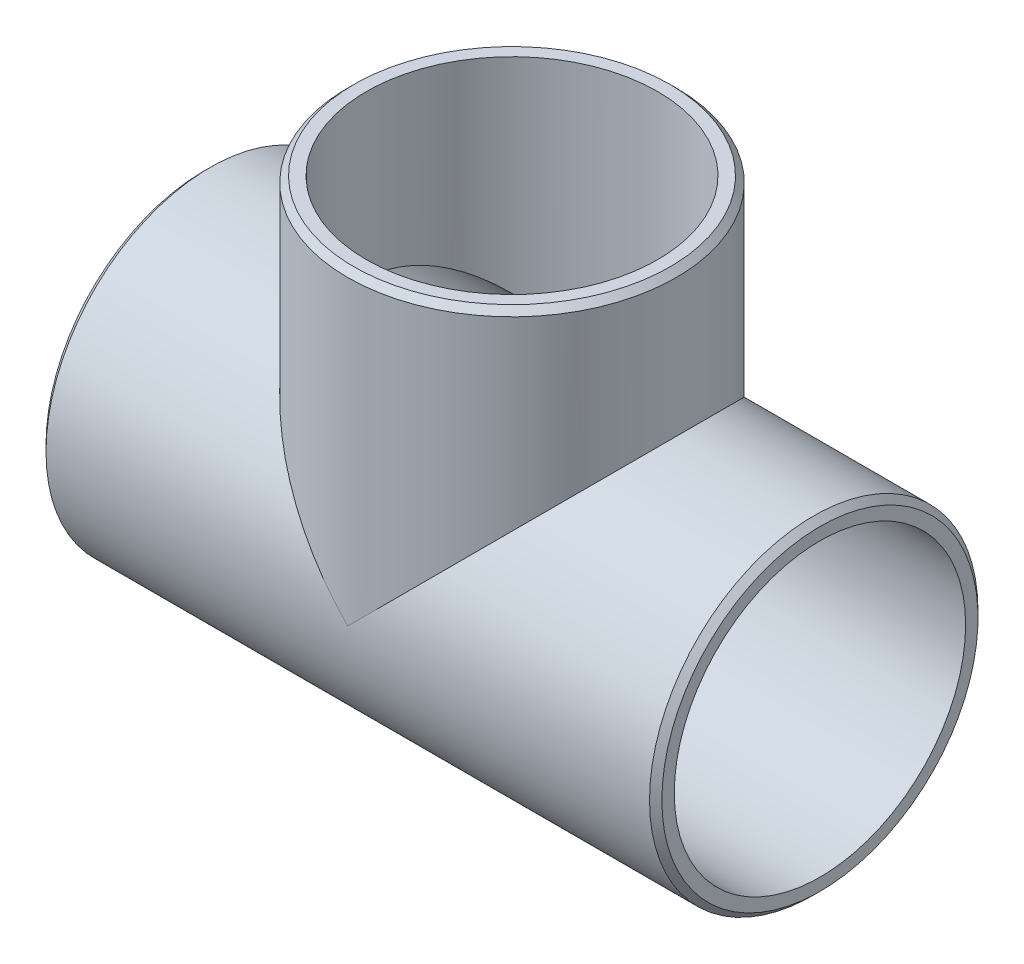
ISO-10303-21;
HEADER;
FILE_DESCRIPTION(('STEP AP214'),'2;1');
FILE_NAME('part.step','',(''),(''),'','','');
FILE_SCHEMA(('AUTOMOTIVE_DESIGN { 1 0 10303 214 1 1 1 1 }'));
ENDSEC;
DATA;
#1=APPLICATION_CONTEXT('core data for automotive mechanical design processes');
#2=APPLICATION_PROTOCOL_DEFINITION('international standard','automotive_design',2000,#1);
#3=PRODUCT_CONTEXT('',#1,'mechanical');
#4=PRODUCT('Part','Part','',(#3));
#5=PRODUCT_RELATED_PRODUCT_CATEGORY('part','',(#4));
#6=PRODUCT_DEFINITION_FORMATION('','',#4);
#7=PRODUCT_DEFINITION_CONTEXT('part definition',#1,'design');
#8=PRODUCT_DEFINITION('design','',#6,#7);
#9=PRODUCT_DEFINITION_SHAPE('','',#8);
#10=(LENGTH_UNIT() NAMED_UNIT(*) SI_UNIT(.MILLI.,.METRE.));
#11=(NAMED_UNIT(*) PLANE_ANGLE_UNIT() SI_UNIT($,.RADIAN.));
#12=(NAMED_UNIT(*) SI_UNIT($,.STERADIAN.) SOLID_ANGLE_UNIT());
#13=UNCERTAINTY_MEASURE_WITH_UNIT(LENGTH_MEASURE(1.E-05),#10,'distance_accuracy_value','');
#14=(GEOMETRIC_REPRESENTATION_CONTEXT(3) GLOBAL_UNCERTAINTY_ASSIGNED_CONTEXT((#13)) GLOBAL_UNIT_ASSIGNED_CONTEXT((#10,
#11,#12)) REPRESENTATION_CONTEXT('',''));
#15=CARTESIAN_POINT('',(0.,0.,0.));
#16=DIRECTION('',(0.,0.,1.));
#17=DIRECTION('',(1.,0.,0.));
#18=AXIS2_PLACEMENT_3D('',#15,#16,#17);
#19=CARTESIAN_POINT('',(-95.25,0.,0.));
#20=DIRECTION('',(-1.,0.,0.));
#21=DIRECTION('',(0.,0.,-1.));
#22=AXIS2_PLACEMENT_3D('',#19,#20,#21);
#23=PLANE('',#22);
#24=CARTESIAN_POINT('',(-95.25,0.,0.));
#25=DIRECTION('',(-1.,0.,0.));
#26=DIRECTION('',(0.,0.,1.));
#27=AXIS2_PLACEMENT_3D('',#24,#25,#26);
#28=CIRCLE('',#27,48.8865333333333);
#29=CARTESIAN_POINT('',(-95.25,0.,48.8865333333333));
#30=VERTEX_POINT('',#29);
#31=EDGE_CURVE('E46',#30,#30,#28,.T.);
#32=ORIENTED_EDGE('',*,*,#31,.T.);
#33=EDGE_LOOP('',(#32));
#34=FACE_BOUND('',#33,.T.);
#35=CARTESIAN_POINT('',(-95.25,0.,0.));
#36=DIRECTION('',(-1.,0.,0.));
#37=DIRECTION('',(0.,0.,1.));
#38=AXIS2_PLACEMENT_3D('',#35,#36,#37);
#39=CIRCLE('',#38,45.0596);
#40=CARTESIAN_POINT('',(-95.25,0.,45.0596));
#41=VERTEX_POINT('',#40);
#42=EDGE_CURVE('E73',#41,#41,#39,.F.);
#43=ORIENTED_EDGE('',*,*,#42,.T.);
#44=EDGE_LOOP('',(#43));
#45=FACE_BOUND('',#44,.T.);
#46=ADVANCED_FACE('F38',(#34,#45),#23,.T.);
#47=CARTESIAN_POINT('',(95.25,0.,0.));
#48=DIRECTION('',(-1.,0.,0.));
#49=DIRECTION('',(0.,0.,1.));
#50=AXIS2_PLACEMENT_3D('',#47,#48,#49);
#51=CYLINDRICAL_SURFACE('',#50,50.8);
#52=CARTESIAN_POINT('',(-93.3365333333333,0.,0.));
#53=DIRECTION('',(-1.,0.,0.));
#54=DIRECTION('',(0.,0.,1.));
#55=AXIS2_PLACEMENT_3D('',#52,#53,#54);
#56=CIRCLE('',#55,50.8);
#57=CARTESIAN_POINT('',(-93.3365333333333,0.,50.8));
#58=VERTEX_POINT('',#57);
#59=EDGE_CURVE('E92',#58,#58,#56,.F.);
#60=ORIENTED_EDGE('',*,*,#59,.T.);
#61=EDGE_LOOP('',(#60));
#62=FACE_BOUND('',#61,.T.);
#63=CARTESIAN_POINT('',(93.3365333333333,0.,0.));
#64=DIRECTION('',(1.,0.,0.));
#65=DIRECTION('',(0.,0.,-1.));
#66=AXIS2_PLACEMENT_3D('',#63,#64,#65);
#67=CIRCLE('',#66,50.8);
#68=CARTESIAN_POINT('',(93.3365333333333,0.,50.8));
#69=VERTEX_POINT('',#68);
#70=EDGE_CURVE('E89',#69,#69,#67,.F.);
#71=ORIENTED_EDGE('',*,*,#70,.T.);
#72=EDGE_LOOP('',(#71));
#73=FACE_BOUND('',#72,.T.);
#74=CARTESIAN_POINT('',(0.,0.,0.));
#75=DIRECTION('',(-0.707106781186547,-0.707106781186547,0.));
#76=DIRECTION('',(-0.707106781186547,0.707106781186547,0.));
#77=AXIS2_PLACEMENT_3D('',#74,#75,#76);
#78=ELLIPSE('',#77,71.8420489685532,50.8);
#79=CARTESIAN_POINT('',(0.,0.,-50.8));
#80=VERTEX_POINT('',#79);
#81=CARTESIAN_POINT('',(0.,0.,50.8));
#82=VERTEX_POINT('',#81);
#83=EDGE_CURVE('E55',#80,#82,#78,.F.);
#84=ORIENTED_EDGE('',*,*,#83,.F.);
#85=CARTESIAN_POINT('',(0.,0.,0.));
#86=DIRECTION('',(-0.707106781186547,0.707106781186547,0.));
#87=DIRECTION('',(-0.707106781186547,-0.707106781186547,0.));
#88=AXIS2_PLACEMENT_3D('',#85,#86,#87);
#89=ELLIPSE('',#88,71.8420489685532,50.8);
#90=EDGE_CURVE('E52',#82,#80,#89,.T.);
#91=ORIENTED_EDGE('',*,*,#90,.F.);
#92=EDGE_LOOP('',(#84,#91));
#93=FACE_BOUND('',#92,.T.);
#94=ADVANCED_FACE('F105',(#62,#73,#93),#51,.T.);
#95=CARTESIAN_POINT('',(95.25,0.,0.));
#96=DIRECTION('',(1.,0.,0.));
#97=DIRECTION('',(0.,0.,-1.));
#98=AXIS2_PLACEMENT_3D('',#95,#96,#97);
#99=PLANE('',#98);
#100=CARTESIAN_POINT('',(95.25,0.,0.));
#101=DIRECTION('',(1.,0.,0.));
#102=DIRECTION('',(0.,0.,-1.));
#103=AXIS2_PLACEMENT_3D('',#100,#101,#102);
#104=CIRCLE('',#103,48.8865333333333);
#105=CARTESIAN_POINT('',(95.25,0.,48.8865333333333));
#106=VERTEX_POINT('',#105);
#107=EDGE_CURVE('E11',#106,#106,#104,.T.);
#108=ORIENTED_EDGE('',*,*,#107,.T.);
#109=EDGE_LOOP('',(#108));
#110=FACE_BOUND('',#109,.T.);
#111=CARTESIAN_POINT('',(95.25,0.,0.));
#112=DIRECTION('',(1.,0.,0.));
#113=DIRECTION('',(0.,0.,-1.));
#114=AXIS2_PLACEMENT_3D('',#111,#112,#113);
#115=CIRCLE('',#114,45.0596);
#116=CARTESIAN_POINT('',(95.25,0.,-45.0596));
#117=VERTEX_POINT('',#116);
#118=EDGE_CURVE('E70',#117,#117,#115,.T.);
#119=ORIENTED_EDGE('',*,*,#118,.F.);
#120=EDGE_LOOP('',(#119));
#121=FACE_BOUND('',#120,.T.);
#122=ADVANCED_FACE('F108',(#110,#121),#99,.T.);
#123=CARTESIAN_POINT('',(0.,95.25,0.));
#124=DIRECTION('',(0.,-1.,0.));
#125=DIRECTION('',(0.,0.,-1.));
#126=AXIS2_PLACEMENT_3D('',#123,#124,#125);
#127=CYLINDRICAL_SURFACE('',#126,50.8);
#128=CARTESIAN_POINT('',(0.,93.3365333333333,0.));
#129=DIRECTION('',(0.,1.,0.));
#130=DIRECTION('',(0.,0.,1.));
#131=AXIS2_PLACEMENT_3D('',#128,#129,#130);
#132=CIRCLE('',#131,50.8);
#133=CARTESIAN_POINT('',(0.,93.3365333333333,-50.8));
#134=VERTEX_POINT('',#133);
#135=EDGE_CURVE('E86',#134,#134,#132,.F.);
#136=ORIENTED_EDGE('',*,*,#135,.T.);
#137=EDGE_LOOP('',(#136));
#138=FACE_BOUND('',#137,.T.);
#139=ORIENTED_EDGE('',*,*,#90,.T.);
#140=ORIENTED_EDGE('',*,*,#83,.T.);
#141=EDGE_LOOP('',(#139,#140));
#142=FACE_BOUND('',#141,.T.);
#143=ADVANCED_FACE('F118',(#138,#142),#127,.T.);
#144=CARTESIAN_POINT('',(0.,95.25,0.));
#145=DIRECTION('',(0.,1.,0.));
#146=DIRECTION('',(0.,0.,1.));
#147=AXIS2_PLACEMENT_3D('',#144,#145,#146);
#148=PLANE('',#147);
#149=CARTESIAN_POINT('',(0.,95.25,0.));
#150=DIRECTION('',(0.,1.,0.));
#151=DIRECTION('',(0.,0.,1.));
#152=AXIS2_PLACEMENT_3D('',#149,#150,#151);
#153=CIRCLE('',#152,48.8865333333333);
#154=CARTESIAN_POINT('',(0.,95.25,-48.8865333333333));
#155=VERTEX_POINT('',#154);
#156=EDGE_CURVE('E83',#155,#155,#153,.T.);
#157=ORIENTED_EDGE('',*,*,#156,.T.);
#158=EDGE_LOOP('',(#157));
#159=FACE_BOUND('',#158,.T.);
#160=CARTESIAN_POINT('',(0.,95.25,0.));
#161=DIRECTION('',(0.,1.,0.));
#162=DIRECTION('',(0.,0.,1.));
#163=AXIS2_PLACEMENT_3D('',#160,#161,#162);
#164=CIRCLE('',#163,45.0596);
#165=CARTESIAN_POINT('',(0.,95.25,45.0596));
#166=VERTEX_POINT('',#165);
#167=EDGE_CURVE('E77',#166,#166,#164,.T.);
#168=ORIENTED_EDGE('',*,*,#167,.F.);
#169=EDGE_LOOP('',(#168));
#170=FACE_BOUND('',#169,.T.);
#171=ADVANCED_FACE('F123',(#159,#170),#148,.T.);
#172=CARTESIAN_POINT('',(95.25,0.,0.));
#173=DIRECTION('',(-1.,0.,0.));
#174=DIRECTION('',(0.,0.,1.));
#175=AXIS2_PLACEMENT_3D('',#172,#173,#174);
#176=CYLINDRICAL_SURFACE('',#175,45.0596);
#177=ORIENTED_EDGE('',*,*,#42,.F.);
#178=EDGE_LOOP('',(#177));
#179=FACE_BOUND('',#178,.T.);
#180=ORIENTED_EDGE('',*,*,#118,.T.);
#181=EDGE_LOOP('',(#180));
#182=FACE_BOUND('',#181,.T.);
#183=CARTESIAN_POINT('',(0.,0.,0.));
#184=DIRECTION('',(-0.707106781186547,-0.707106781186547,0.));
#185=DIRECTION('',(-0.707106781186547,0.707106781186547,0.));
#186=AXIS2_PLACEMENT_3D('',#183,#184,#185);
#187=ELLIPSE('',#186,63.7238974351067,45.0596);
#188=CARTESIAN_POINT('',(0.,0.,-45.0596));
#189=VERTEX_POINT('',#188);
#190=CARTESIAN_POINT('',(0.,0.,45.0596));
#191=VERTEX_POINT('',#190);
#192=EDGE_CURVE('E63',#189,#191,#187,.F.);
#193=ORIENTED_EDGE('',*,*,#192,.T.);
#194=CARTESIAN_POINT('',(0.,0.,0.));
#195=DIRECTION('',(-0.707106781186547,0.707106781186547,0.));
#196=DIRECTION('',(-0.707106781186547,-0.707106781186547,0.));
#197=AXIS2_PLACEMENT_3D('',#194,#195,#196);
#198=ELLIPSE('',#197,63.7238974351067,45.0596);
#199=EDGE_CURVE('E66',#191,#189,#198,.T.);
#200=ORIENTED_EDGE('',*,*,#199,.T.);
#201=EDGE_LOOP('',(#193,#200));
#202=FACE_BOUND('',#201,.T.);
#203=ADVANCED_FACE('F69',(#179,#182,#202),#176,.F.);
#204=CARTESIAN_POINT('',(0.,95.25,0.));
#205=DIRECTION('',(0.,-1.,0.));
#206=DIRECTION('',(0.,0.,-1.));
#207=AXIS2_PLACEMENT_3D('',#204,#205,#206);
#208=CYLINDRICAL_SURFACE('',#207,45.0596);
#209=ORIENTED_EDGE('',*,*,#167,.T.);
#210=EDGE_LOOP('',(#209));
#211=FACE_BOUND('',#210,.T.);
#212=ORIENTED_EDGE('',*,*,#199,.F.);
#213=ORIENTED_EDGE('',*,*,#192,.F.);
#214=EDGE_LOOP('',(#212,#213));
#215=FACE_BOUND('',#214,.T.);
#216=ADVANCED_FACE('F65',(#211,#215),#208,.F.);
#217=CARTESIAN_POINT('',(0.,95.25,0.));
#218=DIRECTION('',(0.,-1.,0.));
#219=DIRECTION('',(0.,0.,-1.));
#220=AXIS2_PLACEMENT_3D('',#217,#218,#219);
#221=CONICAL_SURFACE('',#220,48.8865333333333,0.785398163397454);
#222=CARTESIAN_POINT('',(0.,93.3365333333333,-50.8));
#223=CARTESIAN_POINT('',(0.,93.3564652777778,-50.7800680555556));
#224=CARTESIAN_POINT('',(0.,93.3763972222222,-50.7601361111111));
#225=CARTESIAN_POINT('',(0.,93.4162611111111,-50.7202722222222));
#226=CARTESIAN_POINT('',(0.,93.4361930555555,-50.7003402777778));
#227=CARTESIAN_POINT('',(0.,93.4760569444444,-50.6604763888889));
#228=CARTESIAN_POINT('',(0.,93.4959888888889,-50.6405444444445));
#229=CARTESIAN_POINT('',(0.,93.5358527777777,-50.6006805555556));
#230=CARTESIAN_POINT('',(0.,93.5557847222222,-50.5807486111111));
#231=CARTESIAN_POINT('',(0.,93.5956486111111,-50.5408847222222));
#232=CARTESIAN_POINT('',(0.,93.6155805555555,-50.5209527777778));
#233=CARTESIAN_POINT('',(0.,93.6554444444444,-50.4810888888889));
#234=CARTESIAN_POINT('',(0.,93.6753763888889,-50.4611569444444));
#235=CARTESIAN_POINT('',(0.,93.7152402777778,-50.4212930555556));
#236=CARTESIAN_POINT('',(0.,93.7351722222222,-50.4013611111111));
#237=CARTESIAN_POINT('',(0.,93.7750361111111,-50.3614972222222));
#238=CARTESIAN_POINT('',(0.,93.7949680555555,-50.3415652777778));
#239=CARTESIAN_POINT('',(0.,93.8348319444444,-50.3017013888889));
#240=CARTESIAN_POINT('',(0.,93.8547638888889,-50.2817694444444));
#241=CARTESIAN_POINT('',(0.,93.8946277777778,-50.2419055555555));
#242=CARTESIAN_POINT('',(0.,93.9145597222222,-50.2219736111111));
#243=CARTESIAN_POINT('',(0.,93.9544236111111,-50.1821097222222));
#244=CARTESIAN_POINT('',(0.,93.9743555555555,-50.1621777777778));
#245=CARTESIAN_POINT('',(0.,94.0142194444444,-50.1223138888889));
#246=CARTESIAN_POINT('',(0.,94.0341513888889,-50.1023819444444));
#247=CARTESIAN_POINT('',(0.,94.0740152777778,-50.0625180555555));
#248=CARTESIAN_POINT('',(0.,94.0939472222222,-50.0425861111111));
#249=CARTESIAN_POINT('',(0.,94.1338111111111,-50.0027222222222));
#250=CARTESIAN_POINT('',(0.,94.1537430555555,-49.9827902777778));
#251=CARTESIAN_POINT('',(0.,94.1936069444444,-49.9429263888889));
#252=CARTESIAN_POINT('',(0.,94.2135388888889,-49.9229944444444));
#253=CARTESIAN_POINT('',(0.,94.2534027777778,-49.8831305555555));
#254=CARTESIAN_POINT('',(0.,94.2733347222222,-49.8631986111111));
#255=CARTESIAN_POINT('',(0.,94.3131986111111,-49.8233347222222));
#256=CARTESIAN_POINT('',(0.,94.3331305555555,-49.8034027777778));
#257=CARTESIAN_POINT('',(0.,94.3729944444444,-49.7635388888889));
#258=CARTESIAN_POINT('',(0.,94.3929263888889,-49.7436069444444));
#259=CARTESIAN_POINT('',(0.,94.4327902777778,-49.7037430555555));
#260=CARTESIAN_POINT('',(0.,94.4527222222222,-49.6838111111111));
#261=CARTESIAN_POINT('',(0.,94.4925861111111,-49.6439472222222));
#262=CARTESIAN_POINT('',(0.,94.5125180555555,-49.6240152777778));
#263=CARTESIAN_POINT('',(0.,94.5523819444444,-49.5841513888889));
#264=CARTESIAN_POINT('',(0.,94.5723138888889,-49.5642194444444));
#265=CARTESIAN_POINT('',(0.,94.6121777777778,-49.5243555555555));
#266=CARTESIAN_POINT('',(0.,94.6321097222222,-49.5044236111111));
#267=CARTESIAN_POINT('',(0.,94.6719736111111,-49.4645597222222));
#268=CARTESIAN_POINT('',(0.,94.6919055555556,-49.4446277777778));
#269=CARTESIAN_POINT('',(0.,94.7317694444444,-49.4047638888889));
#270=CARTESIAN_POINT('',(0.,94.7517013888889,-49.3848319444444));
#271=CARTESIAN_POINT('',(0.,94.7915652777778,-49.3449680555555));
#272=CARTESIAN_POINT('',(0.,94.8114972222222,-49.3250361111111));
#273=CARTESIAN_POINT('',(0.,94.8513611111111,-49.2851722222222));
#274=CARTESIAN_POINT('',(0.,94.8712930555556,-49.2652402777778));
#275=CARTESIAN_POINT('',(0.,94.9111569444444,-49.2253763888889));
#276=CARTESIAN_POINT('',(0.,94.9310888888889,-49.2054444444444));
#277=CARTESIAN_POINT('',(0.,94.9709527777778,-49.1655805555555));
#278=CARTESIAN_POINT('',(0.,94.9908847222222,-49.1456486111111));
#279=CARTESIAN_POINT('',(0.,95.0307486111111,-49.1057847222222));
#280=CARTESIAN_POINT('',(0.,95.0506805555556,-49.0858527777778));
#281=CARTESIAN_POINT('',(0.,95.0905444444444,-49.0459888888889));
#282=CARTESIAN_POINT('',(0.,95.1104763888889,-49.0260569444444));
#283=CARTESIAN_POINT('',(0.,95.1503402777778,-48.9861930555555));
#284=CARTESIAN_POINT('',(0.,95.1702722222222,-48.9662611111111));
#285=CARTESIAN_POINT('',(0.,95.2101361111111,-48.9263972222222));
#286=CARTESIAN_POINT('',(0.,95.2300680555556,-48.9064652777777));
#287=CARTESIAN_POINT('',(0.,95.25,-48.8865333333333));
#288=B_SPLINE_CURVE_WITH_KNOTS('',3,(#222,#223,#224,#225,#226,#227,#228,#229,#230,#231,#232,
#233,#234,#235,#236,#237,#238,#239,#240,#241,#242,#243,#244,#245,#246,#247,#248,#249,#250,#251,
#252,#253,#254,#255,#256,#257,#258,#259,#260,#261,#262,#263,#264,#265,#266,#267,#268,#269,#270,
#271,#272,#273,#274,#275,#276,#277,#278,#279,#280,#281,#282,#283,#284,#285,#286,#287),
.UNSPECIFIED.,.F.,.F.,(4,2,2,2,2,2,2,2,2,2,2,2,2,2,2,2,2,2,2,2,2,2,2,2,2,2,2,2,2,2,2,2,4),(0.,
0.0845640784733927,0.169128156946795,0.253692235420198,0.3382563138936,0.422820392367003,
0.507384470840405,0.591948549313808,0.676512627787211,0.761076706260613,0.845640784734016,
0.930204863207418,1.01476894168082,1.09933302015422,1.18389709862763,1.26846117710103,
1.35302525557444,1.43758933404784,1.52215341252124,1.60671749099464,1.69128156946805,
1.77584564794145,1.86040972641485,1.94497380488825,2.02953788336166,2.11410196183506,
2.19866604030846,2.28323011878186,2.36779419725527,2.45235827572867,2.53692235420207,
2.62148643267547,2.70605051114887),.UNSPECIFIED.);
#289=EDGE_CURVE('BSEAM102',#134,#155,#288,.T.);
#290=ORIENTED_EDGE('',*,*,#135,.F.);
#291=ORIENTED_EDGE('',*,*,#156,.F.);
#292=ORIENTED_EDGE('',*,*,#289,.T.);
#293=ORIENTED_EDGE('',*,*,#289,.F.);
#294=EDGE_LOOP('',(#290,#292,#291,#293));
#295=FACE_BOUND('',#294,.T.);
#296=ADVANCED_FACE('F102',(#295),#221,.T.);
#297=CARTESIAN_POINT('',(-93.3365333333333,0.,0.));
#298=DIRECTION('',(1.,0.,0.));
#299=DIRECTION('',(0.,0.,-1.));
#300=AXIS2_PLACEMENT_3D('',#297,#298,#299);
#301=CONICAL_SURFACE('',#300,50.8,0.78539816339745);
#302=ORIENTED_EDGE('',*,*,#31,.F.);
#303=EDGE_LOOP('',(#302));
#304=FACE_BOUND('',#303,.T.);
#305=ORIENTED_EDGE('',*,*,#59,.F.);
#306=EDGE_LOOP('',(#305));
#307=FACE_BOUND('',#306,.T.);
#308=ADVANCED_FACE('F99',(#304,#307),#301,.T.);
#309=CARTESIAN_POINT('',(95.25,0.,0.));
#310=DIRECTION('',(-1.,0.,0.));
#311=DIRECTION('',(0.,0.,1.));
#312=AXIS2_PLACEMENT_3D('',#309,#310,#311);
#313=CONICAL_SURFACE('',#312,48.8865333333333,0.785398163397454);
#314=CARTESIAN_POINT('',(93.3365333333333,0.,50.8));
#315=CARTESIAN_POINT('',(93.3564652777778,0.,50.7800680555556));
#316=CARTESIAN_POINT('',(93.3763972222222,0.,50.7601361111111));
#317=CARTESIAN_POINT('',(93.4162611111111,0.,50.7202722222222));
#318=CARTESIAN_POINT('',(93.4361930555555,0.,50.7003402777778));
#319=CARTESIAN_POINT('',(93.4760569444444,0.,50.6604763888889));
#320=CARTESIAN_POINT('',(93.4959888888889,0.,50.6405444444445));
#321=CARTESIAN_POINT('',(93.5358527777777,0.,50.6006805555556));
#322=CARTESIAN_POINT('',(93.5557847222222,0.,50.5807486111111));
#323=CARTESIAN_POINT('',(93.5956486111111,0.,50.5408847222222));
#324=CARTESIAN_POINT('',(93.6155805555555,0.,50.5209527777778));
#325=CARTESIAN_POINT('',(93.6554444444444,0.,50.4810888888889));
#326=CARTESIAN_POINT('',(93.6753763888889,0.,50.4611569444444));
#327=CARTESIAN_POINT('',(93.7152402777778,0.,50.4212930555556));
#328=CARTESIAN_POINT('',(93.7351722222222,0.,50.4013611111111));
#329=CARTESIAN_POINT('',(93.7750361111111,0.,50.3614972222222));
#330=CARTESIAN_POINT('',(93.7949680555555,0.,50.3415652777778));
#331=CARTESIAN_POINT('',(93.8348319444444,0.,50.3017013888889));
#332=CARTESIAN_POINT('',(93.8547638888889,0.,50.2817694444444));
#333=CARTESIAN_POINT('',(93.8946277777778,0.,50.2419055555555));
#334=CARTESIAN_POINT('',(93.9145597222222,0.,50.2219736111111));
#335=CARTESIAN_POINT('',(93.9544236111111,0.,50.1821097222222));
#336=CARTESIAN_POINT('',(93.9743555555555,0.,50.1621777777778));
#337=CARTESIAN_POINT('',(94.0142194444444,0.,50.1223138888889));
#338=CARTESIAN_POINT('',(94.0341513888889,0.,50.1023819444444));
#339=CARTESIAN_POINT('',(94.0740152777778,0.,50.0625180555555));
#340=CARTESIAN_POINT('',(94.0939472222222,0.,50.0425861111111));
#341=CARTESIAN_POINT('',(94.1338111111111,0.,50.0027222222222));
#342=CARTESIAN_POINT('',(94.1537430555555,0.,49.9827902777778));
#343=CARTESIAN_POINT('',(94.1936069444444,0.,49.9429263888889));
#344=CARTESIAN_POINT('',(94.2135388888889,0.,49.9229944444444));
#345=CARTESIAN_POINT('',(94.2534027777778,0.,49.8831305555555));
#346=CARTESIAN_POINT('',(94.2733347222222,0.,49.8631986111111));
#347=CARTESIAN_POINT('',(94.3131986111111,0.,49.8233347222222));
#348=CARTESIAN_POINT('',(94.3331305555555,0.,49.8034027777778));
#349=CARTESIAN_POINT('',(94.3729944444444,0.,49.7635388888889));
#350=CARTESIAN_POINT('',(94.3929263888889,0.,49.7436069444444));
#351=CARTESIAN_POINT('',(94.4327902777778,0.,49.7037430555555));
#352=CARTESIAN_POINT('',(94.4527222222222,0.,49.6838111111111));
#353=CARTESIAN_POINT('',(94.4925861111111,0.,49.6439472222222));
#354=CARTESIAN_POINT('',(94.5125180555555,0.,49.6240152777778));
#355=CARTESIAN_POINT('',(94.5523819444444,0.,49.5841513888889));
#356=CARTESIAN_POINT('',(94.5723138888889,0.,49.5642194444444));
#357=CARTESIAN_POINT('',(94.6121777777778,0.,49.5243555555555));
#358=CARTESIAN_POINT('',(94.6321097222222,0.,49.5044236111111));
#359=CARTESIAN_POINT('',(94.6719736111111,0.,49.4645597222222));
#360=CARTESIAN_POINT('',(94.6919055555556,0.,49.4446277777778));
#361=CARTESIAN_POINT('',(94.7317694444444,0.,49.4047638888889));
#362=CARTESIAN_POINT('',(94.7517013888889,0.,49.3848319444444));
#363=CARTESIAN_POINT('',(94.7915652777778,0.,49.3449680555555));
#364=CARTESIAN_POINT('',(94.8114972222222,0.,49.3250361111111));
#365=CARTESIAN_POINT('',(94.8513611111111,0.,49.2851722222222));
#366=CARTESIAN_POINT('',(94.8712930555556,0.,49.2652402777778));
#367=CARTESIAN_POINT('',(94.9111569444444,0.,49.2253763888889));
#368=CARTESIAN_POINT('',(94.9310888888889,0.,49.2054444444444));
#369=CARTESIAN_POINT('',(94.9709527777778,0.,49.1655805555555));
#370=CARTESIAN_POINT('',(94.9908847222222,0.,49.1456486111111));
#371=CARTESIAN_POINT('',(95.0307486111111,0.,49.1057847222222));
#372=CARTESIAN_POINT('',(95.0506805555556,0.,49.0858527777778));
#373=CARTESIAN_POINT('',(95.0905444444444,0.,49.0459888888889));
#374=CARTESIAN_POINT('',(95.1104763888889,0.,49.0260569444444));
#375=CARTESIAN_POINT('',(95.1503402777778,0.,48.9861930555555));
#376=CARTESIAN_POINT('',(95.1702722222222,0.,48.9662611111111));
#377=CARTESIAN_POINT('',(95.2101361111111,0.,48.9263972222222));
#378=CARTESIAN_POINT('',(95.2300680555556,0.,48.9064652777777));
#379=CARTESIAN_POINT('',(95.25,0.,48.8865333333333));
#380=B_SPLINE_CURVE_WITH_KNOTS('',3,(#314,#315,#316,#317,#318,#319,#320,#321,#322,#323,#324,
#325,#326,#327,#328,#329,#330,#331,#332,#333,#334,#335,#336,#337,#338,#339,#340,#341,#342,#343,
#344,#345,#346,#347,#348,#349,#350,#351,#352,#353,#354,#355,#356,#357,#358,#359,#360,#361,#362,
#363,#364,#365,#366,#367,#368,#369,#370,#371,#372,#373,#374,#375,#376,#377,#378,#379),
.UNSPECIFIED.,.F.,.F.,(4,2,2,2,2,2,2,2,2,2,2,2,2,2,2,2,2,2,2,2,2,2,2,2,2,2,2,2,2,2,2,2,4),(0.,
0.0845640784733927,0.169128156946795,0.253692235420198,0.3382563138936,0.422820392367003,
0.507384470840405,0.591948549313808,0.676512627787211,0.761076706260613,0.845640784734016,
0.930204863207418,1.01476894168082,1.09933302015422,1.18389709862763,1.26846117710103,
1.35302525557444,1.43758933404784,1.52215341252124,1.60671749099464,1.69128156946805,
1.77584564794145,1.86040972641485,1.94497380488825,2.02953788336166,2.11410196183506,
2.19866604030846,2.28323011878186,2.36779419725527,2.45235827572867,2.53692235420207,
2.62148643267547,2.70605051114887),.UNSPECIFIED.);
#381=EDGE_CURVE('BSEAM40',#69,#106,#380,.T.);
#382=ORIENTED_EDGE('',*,*,#70,.F.);
#383=ORIENTED_EDGE('',*,*,#107,.F.);
#384=ORIENTED_EDGE('',*,*,#381,.T.);
#385=ORIENTED_EDGE('',*,*,#381,.F.);
#386=EDGE_LOOP('',(#382,#384,#383,#385));
#387=FACE_BOUND('',#386,.T.);
#388=ADVANCED_FACE('F40',(#387),#313,.T.);
#389=CLOSED_SHELL('',(#46,#94,#122,#143,#171,#203,#216,#296,#308,#388));
#390=MANIFOLD_SOLID_BREP('B2',#389);
#391=ADVANCED_BREP_SHAPE_REPRESENTATION('',(#18,#390),#14);
#392=SHAPE_DEFINITION_REPRESENTATION(#9,#391);
ENDSEC;
END-ISO-10303-21;
